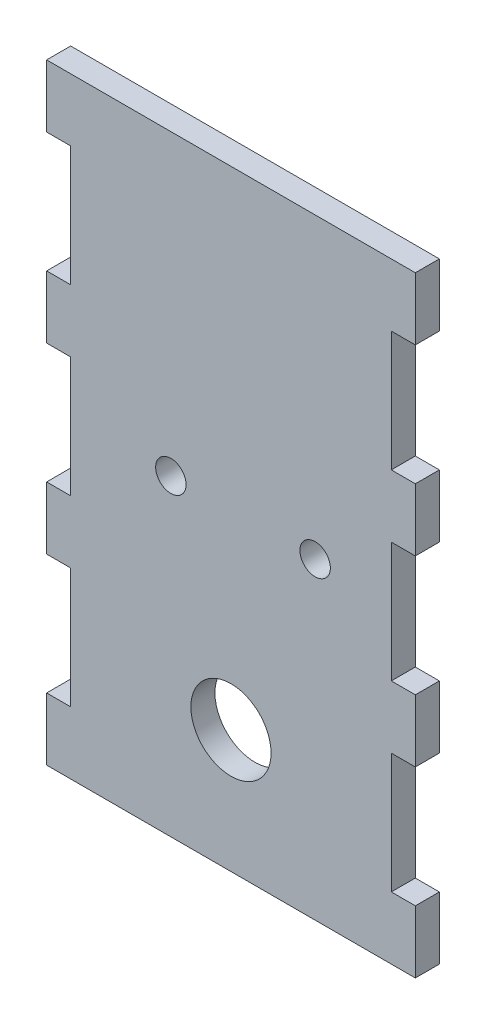
ISO-10303-21;
HEADER;
FILE_DESCRIPTION(('STEP AP214'),'2;1');
FILE_NAME('part.step','',(''),(''),'','','');
FILE_SCHEMA(('AUTOMOTIVE_DESIGN { 1 0 10303 214 1 1 1 1 }'));
ENDSEC;
DATA;
#1=APPLICATION_CONTEXT('core data for automotive mechanical design processes');
#2=APPLICATION_PROTOCOL_DEFINITION('international standard','automotive_design',2000,#1);
#3=PRODUCT_CONTEXT('',#1,'mechanical');
#4=PRODUCT('Part','Part','',(#3));
#5=PRODUCT_RELATED_PRODUCT_CATEGORY('part','',(#4));
#6=PRODUCT_DEFINITION_FORMATION('','',#4);
#7=PRODUCT_DEFINITION_CONTEXT('part definition',#1,'design');
#8=PRODUCT_DEFINITION('design','',#6,#7);
#9=PRODUCT_DEFINITION_SHAPE('','',#8);
#10=(LENGTH_UNIT() NAMED_UNIT(*) SI_UNIT(.MILLI.,.METRE.));
#11=(NAMED_UNIT(*) PLANE_ANGLE_UNIT() SI_UNIT($,.RADIAN.));
#12=(NAMED_UNIT(*) SI_UNIT($,.STERADIAN.) SOLID_ANGLE_UNIT());
#13=UNCERTAINTY_MEASURE_WITH_UNIT(LENGTH_MEASURE(1.E-05),#10,'distance_accuracy_value','');
#14=(GEOMETRIC_REPRESENTATION_CONTEXT(3) GLOBAL_UNCERTAINTY_ASSIGNED_CONTEXT((#13)) GLOBAL_UNIT_ASSIGNED_CONTEXT((#10,
#11,#12)) REPRESENTATION_CONTEXT('',''));
#15=CARTESIAN_POINT('',(0.,0.,0.));
#16=DIRECTION('',(0.,0.,1.));
#17=DIRECTION('',(1.,0.,0.));
#18=AXIS2_PLACEMENT_3D('',#15,#16,#17);
#19=CARTESIAN_POINT('',(5.00653935185185,16.5420138888889,3.));
#20=DIRECTION('',(-1.,0.,0.));
#21=DIRECTION('',(0.,-1.,0.));
#22=AXIS2_PLACEMENT_3D('',#19,#20,#21);
#23=PLANE('',#22);
#24=DIRECTION('',(0.,1.,0.));
#25=VECTOR('',#24,1.);
#26=CARTESIAN_POINT('',(5.00653935185185,16.5420138888889,0.));
#27=LINE('',#26,#25);
#28=CARTESIAN_POINT('',(5.00653935185185,-36.8579861111111,0.));
#29=VERTEX_POINT('',#28);
#30=CARTESIAN_POINT('',(5.00653935185186,-29.0579861111111,0.));
#31=VERTEX_POINT('',#30);
#32=EDGE_CURVE('E236',#29,#31,#27,.T.);
#33=ORIENTED_EDGE('',*,*,#32,.T.);
#34=DIRECTION('',(0.,0.,1.));
#35=VECTOR('',#34,1.);
#36=CARTESIAN_POINT('',(5.00653935185186,-29.0579861111111,0.));
#37=LINE('',#36,#35);
#38=CARTESIAN_POINT('',(5.00653935185186,-29.0579861111111,3.));
#39=VERTEX_POINT('',#38);
#40=EDGE_CURVE('E356',#31,#39,#37,.T.);
#41=ORIENTED_EDGE('',*,*,#40,.T.);
#42=DIRECTION('',(0.,1.,0.));
#43=VECTOR('',#42,1.);
#44=CARTESIAN_POINT('',(5.00653935185185,16.5420138888889,3.));
#45=LINE('',#44,#43);
#46=CARTESIAN_POINT('',(5.00653935185185,-36.8579861111111,3.));
#47=VERTEX_POINT('',#46);
#48=EDGE_CURVE('E238',#47,#39,#45,.T.);
#49=ORIENTED_EDGE('',*,*,#48,.F.);
#50=DIRECTION('',(0.,0.,1.));
#51=VECTOR('',#50,1.);
#52=CARTESIAN_POINT('',(5.00653935185185,-36.8579861111111,0.));
#53=LINE('',#52,#51);
#54=EDGE_CURVE('E223',#29,#47,#53,.T.);
#55=ORIENTED_EDGE('',*,*,#54,.F.);
#56=EDGE_LOOP('',(#33,#41,#49,#55));
#57=FACE_BOUND('',#56,.T.);
#58=ADVANCED_FACE('F34',(#57),#23,.F.);
#59=CARTESIAN_POINT('',(5.00653935185186,-59.6579861111111,0.));
#60=VERTEX_POINT('',#59);
#61=CARTESIAN_POINT('',(5.00653935185185,-51.8579861111111,0.));
#62=VERTEX_POINT('',#61);
#63=EDGE_CURVE('E245',#60,#62,#27,.T.);
#64=ORIENTED_EDGE('',*,*,#63,.T.);
#65=DIRECTION('',(0.,0.,1.));
#66=VECTOR('',#65,1.);
#67=CARTESIAN_POINT('',(5.00653935185185,-51.8579861111111,0.));
#68=LINE('',#67,#66);
#69=CARTESIAN_POINT('',(5.00653935185185,-51.8579861111111,3.));
#70=VERTEX_POINT('',#69);
#71=EDGE_CURVE('E384',#62,#70,#68,.T.);
#72=ORIENTED_EDGE('',*,*,#71,.T.);
#73=CARTESIAN_POINT('',(5.00653935185186,-59.6579861111111,3.));
#74=VERTEX_POINT('',#73);
#75=EDGE_CURVE('E272',#74,#70,#45,.T.);
#76=ORIENTED_EDGE('',*,*,#75,.F.);
#77=DIRECTION('',(0.,0.,-1.));
#78=VECTOR('',#77,1.);
#79=CARTESIAN_POINT('',(5.00653935185186,-59.6579861111111,3.));
#80=LINE('',#79,#78);
#81=EDGE_CURVE('E42',#74,#60,#80,.T.);
#82=ORIENTED_EDGE('',*,*,#81,.T.);
#83=EDGE_LOOP('',(#64,#72,#76,#82));
#84=FACE_BOUND('',#83,.T.);
#85=ADVANCED_FACE('F526',(#84),#23,.F.);
#86=CARTESIAN_POINT('',(-40.9934606481482,16.5420138888889,3.));
#87=DIRECTION('',(1.,0.,0.));
#88=DIRECTION('',(0.,0.,-1.));
#89=AXIS2_PLACEMENT_3D('',#86,#87,#88);
#90=PLANE('',#89);
#91=DIRECTION('',(0.,-1.,0.));
#92=VECTOR('',#91,1.);
#93=CARTESIAN_POINT('',(-40.9934606481482,16.5420138888889,0.));
#94=LINE('',#93,#92);
#95=CARTESIAN_POINT('',(-40.9934606481481,-29.0579861111111,0.));
#96=VERTEX_POINT('',#95);
#97=CARTESIAN_POINT('',(-40.9934606481482,-36.8579861111111,0.));
#98=VERTEX_POINT('',#97);
#99=EDGE_CURVE('E537',#96,#98,#94,.T.);
#100=ORIENTED_EDGE('',*,*,#99,.T.);
#101=DIRECTION('',(0.,0.,1.));
#102=VECTOR('',#101,1.);
#103=CARTESIAN_POINT('',(-40.9934606481482,-36.8579861111111,0.));
#104=LINE('',#103,#102);
#105=CARTESIAN_POINT('',(-40.9934606481482,-36.8579861111111,3.));
#106=VERTEX_POINT('',#105);
#107=EDGE_CURVE('E371',#98,#106,#104,.T.);
#108=ORIENTED_EDGE('',*,*,#107,.T.);
#109=DIRECTION('',(0.,-1.,0.));
#110=VECTOR('',#109,1.);
#111=CARTESIAN_POINT('',(-40.9934606481482,16.5420138888889,3.));
#112=LINE('',#111,#110);
#113=CARTESIAN_POINT('',(-40.9934606481481,-29.0579861111111,3.));
#114=VERTEX_POINT('',#113);
#115=EDGE_CURVE('E515',#114,#106,#112,.T.);
#116=ORIENTED_EDGE('',*,*,#115,.F.);
#117=DIRECTION('',(0.,0.,1.));
#118=VECTOR('',#117,1.);
#119=CARTESIAN_POINT('',(-40.9934606481481,-29.0579861111111,0.));
#120=LINE('',#119,#118);
#121=EDGE_CURVE('E338',#96,#114,#120,.T.);
#122=ORIENTED_EDGE('',*,*,#121,.F.);
#123=EDGE_LOOP('',(#100,#108,#116,#122));
#124=FACE_BOUND('',#123,.T.);
#125=ADVANCED_FACE('F551',(#124),#90,.F.);
#126=CARTESIAN_POINT('',(-40.9934606481481,-6.25798611111111,0.));
#127=VERTEX_POINT('',#126);
#128=CARTESIAN_POINT('',(-40.9934606481482,-14.0579861111111,0.));
#129=VERTEX_POINT('',#128);
#130=EDGE_CURVE('E265',#127,#129,#94,.T.);
#131=ORIENTED_EDGE('',*,*,#130,.T.);
#132=DIRECTION('',(0.,0.,1.));
#133=VECTOR('',#132,1.);
#134=CARTESIAN_POINT('',(-40.9934606481482,-14.0579861111111,0.));
#135=LINE('',#134,#133);
#136=CARTESIAN_POINT('',(-40.9934606481482,-14.0579861111111,3.));
#137=VERTEX_POINT('',#136);
#138=EDGE_CURVE('E305',#129,#137,#135,.T.);
#139=ORIENTED_EDGE('',*,*,#138,.T.);
#140=CARTESIAN_POINT('',(-40.9934606481481,-6.25798611111111,3.));
#141=VERTEX_POINT('',#140);
#142=EDGE_CURVE('E282',#141,#137,#112,.T.);
#143=ORIENTED_EDGE('',*,*,#142,.F.);
#144=DIRECTION('',(0.,0.,1.));
#145=VECTOR('',#144,1.);
#146=CARTESIAN_POINT('',(-40.9934606481481,-6.25798611111111,0.));
#147=LINE('',#146,#145);
#148=EDGE_CURVE('E313',#127,#141,#147,.T.);
#149=ORIENTED_EDGE('',*,*,#148,.F.);
#150=EDGE_LOOP('',(#131,#139,#143,#149));
#151=FACE_BOUND('',#150,.T.);
#152=ADVANCED_FACE('F513',(#151),#90,.F.);
#153=CARTESIAN_POINT('',(-40.9934606481482,16.5420138888889,0.));
#154=VERTEX_POINT('',#153);
#155=CARTESIAN_POINT('',(-40.9934606481482,8.74201388888889,0.));
#156=VERTEX_POINT('',#155);
#157=EDGE_CURVE('E259',#154,#156,#94,.T.);
#158=ORIENTED_EDGE('',*,*,#157,.T.);
#159=DIRECTION('',(0.,0.,1.));
#160=VECTOR('',#159,1.);
#161=CARTESIAN_POINT('',(-40.9934606481482,8.74201388888889,0.));
#162=LINE('',#161,#160);
#163=CARTESIAN_POINT('',(-40.9934606481482,8.74201388888889,3.));
#164=VERTEX_POINT('',#163);
#165=EDGE_CURVE('E320',#156,#164,#162,.T.);
#166=ORIENTED_EDGE('',*,*,#165,.T.);
#167=CARTESIAN_POINT('',(-40.9934606481482,16.5420138888889,3.));
#168=VERTEX_POINT('',#167);
#169=EDGE_CURVE('E279',#168,#164,#112,.T.);
#170=ORIENTED_EDGE('',*,*,#169,.F.);
#171=DIRECTION('',(0.,0.,-1.));
#172=VECTOR('',#171,1.);
#173=CARTESIAN_POINT('',(-40.9934606481482,16.5420138888889,3.));
#174=LINE('',#173,#172);
#175=EDGE_CURVE('E271',#168,#154,#174,.T.);
#176=ORIENTED_EDGE('',*,*,#175,.T.);
#177=EDGE_LOOP('',(#158,#166,#170,#176));
#178=FACE_BOUND('',#177,.T.);
#179=ADVANCED_FACE('F495',(#178),#90,.F.);
#180=CARTESIAN_POINT('',(5.00653935185186,-14.0579861111111,3.));
#181=VERTEX_POINT('',#180);
#182=CARTESIAN_POINT('',(5.00653935185186,-6.25798611111111,3.));
#183=VERTEX_POINT('',#182);
#184=EDGE_CURVE('E275',#181,#183,#45,.T.);
#185=ORIENTED_EDGE('',*,*,#184,.F.);
#186=DIRECTION('',(0.,0.,1.));
#187=VECTOR('',#186,1.);
#188=CARTESIAN_POINT('',(5.00653935185186,-14.0579861111111,0.));
#189=LINE('',#188,#187);
#190=CARTESIAN_POINT('',(5.00653935185186,-14.0579861111111,0.));
#191=VERTEX_POINT('',#190);
#192=EDGE_CURVE('E390',#191,#181,#189,.T.);
#193=ORIENTED_EDGE('',*,*,#192,.F.);
#194=CARTESIAN_POINT('',(5.00653935185186,-6.25798611111111,0.));
#195=VERTEX_POINT('',#194);
#196=EDGE_CURVE('E246',#191,#195,#27,.T.);
#197=ORIENTED_EDGE('',*,*,#196,.T.);
#198=DIRECTION('',(0.,0.,1.));
#199=VECTOR('',#198,1.);
#200=CARTESIAN_POINT('',(5.00653935185186,-6.25798611111111,0.));
#201=LINE('',#200,#199);
#202=EDGE_CURVE('E291',#195,#183,#201,.T.);
#203=ORIENTED_EDGE('',*,*,#202,.T.);
#204=EDGE_LOOP('',(#185,#193,#197,#203));
#205=FACE_BOUND('',#204,.T.);
#206=ADVANCED_FACE('F477',(#205),#23,.F.);
#207=CARTESIAN_POINT('',(-40.9934606481482,-51.8579861111111,3.));
#208=VERTEX_POINT('',#207);
#209=CARTESIAN_POINT('',(-40.9934606481482,-59.6579861111111,3.));
#210=VERTEX_POINT('',#209);
#211=EDGE_CURVE('E283',#208,#210,#112,.T.);
#212=ORIENTED_EDGE('',*,*,#211,.F.);
#213=DIRECTION('',(0.,0.,1.));
#214=VECTOR('',#213,1.);
#215=CARTESIAN_POINT('',(-40.9934606481482,-51.8579861111111,0.));
#216=LINE('',#215,#214);
#217=CARTESIAN_POINT('',(-40.9934606481482,-51.8579861111111,0.));
#218=VERTEX_POINT('',#217);
#219=EDGE_CURVE('E364',#218,#208,#216,.T.);
#220=ORIENTED_EDGE('',*,*,#219,.F.);
#221=CARTESIAN_POINT('',(-40.9934606481482,-59.6579861111111,0.));
#222=VERTEX_POINT('',#221);
#223=EDGE_CURVE('E267',#218,#222,#94,.T.);
#224=ORIENTED_EDGE('',*,*,#223,.T.);
#225=DIRECTION('',(0.,0.,-1.));
#226=VECTOR('',#225,1.);
#227=CARTESIAN_POINT('',(-40.9934606481482,-59.6579861111111,3.));
#228=LINE('',#227,#226);
#229=EDGE_CURVE('E11',#210,#222,#228,.T.);
#230=ORIENTED_EDGE('',*,*,#229,.F.);
#231=EDGE_LOOP('',(#212,#220,#224,#230));
#232=FACE_BOUND('',#231,.T.);
#233=ADVANCED_FACE('F36',(#232),#90,.F.);
#234=CARTESIAN_POINT('',(-40.9934606481482,-59.6579861111111,3.));
#235=DIRECTION('',(0.,1.,0.));
#236=DIRECTION('',(0.,0.,1.));
#237=AXIS2_PLACEMENT_3D('',#234,#235,#236);
#238=PLANE('',#237);
#239=DIRECTION('',(1.,0.,0.));
#240=VECTOR('',#239,1.);
#241=CARTESIAN_POINT('',(-40.9934606481482,-59.6579861111111,0.));
#242=LINE('',#241,#240);
#243=EDGE_CURVE('E253',#222,#60,#242,.T.);
#244=ORIENTED_EDGE('',*,*,#243,.T.);
#245=ORIENTED_EDGE('',*,*,#81,.F.);
#246=DIRECTION('',(1.,0.,0.));
#247=VECTOR('',#246,1.);
#248=CARTESIAN_POINT('',(-40.9934606481482,-59.6579861111111,3.));
#249=LINE('',#248,#247);
#250=EDGE_CURVE('E277',#210,#74,#249,.T.);
#251=ORIENTED_EDGE('',*,*,#250,.F.);
#252=ORIENTED_EDGE('',*,*,#229,.T.);
#253=EDGE_LOOP('',(#244,#245,#251,#252));
#254=FACE_BOUND('',#253,.T.);
#255=ADVANCED_FACE('F534',(#254),#238,.F.);
#256=CARTESIAN_POINT('',(5.00653935185186,8.74201388888887,3.));
#257=VERTEX_POINT('',#256);
#258=CARTESIAN_POINT('',(5.00653935185185,16.5420138888889,3.));
#259=VERTEX_POINT('',#258);
#260=EDGE_CURVE('E276',#257,#259,#45,.T.);
#261=ORIENTED_EDGE('',*,*,#260,.F.);
#262=DIRECTION('',(0.,0.,1.));
#263=VECTOR('',#262,1.);
#264=CARTESIAN_POINT('',(5.00653935185186,8.74201388888887,0.));
#265=LINE('',#264,#263);
#266=CARTESIAN_POINT('',(5.00653935185186,8.74201388888887,0.));
#267=VERTEX_POINT('',#266);
#268=EDGE_CURVE('E284',#267,#257,#265,.T.);
#269=ORIENTED_EDGE('',*,*,#268,.F.);
#270=CARTESIAN_POINT('',(5.00653935185185,16.5420138888889,0.));
#271=VERTEX_POINT('',#270);
#272=EDGE_CURVE('E248',#267,#271,#27,.T.);
#273=ORIENTED_EDGE('',*,*,#272,.T.);
#274=DIRECTION('',(0.,0.,-1.));
#275=VECTOR('',#274,1.);
#276=CARTESIAN_POINT('',(5.00653935185185,16.5420138888889,3.));
#277=LINE('',#276,#275);
#278=EDGE_CURVE('E485',#259,#271,#277,.T.);
#279=ORIENTED_EDGE('',*,*,#278,.F.);
#280=EDGE_LOOP('',(#261,#269,#273,#279));
#281=FACE_BOUND('',#280,.T.);
#282=ADVANCED_FACE('F486',(#281),#23,.F.);
#283=CARTESIAN_POINT('',(-40.9934606481482,16.5420138888889,3.));
#284=DIRECTION('',(0.,-1.,0.));
#285=DIRECTION('',(0.,0.,-1.));
#286=AXIS2_PLACEMENT_3D('',#283,#284,#285);
#287=PLANE('',#286);
#288=DIRECTION('',(-1.,0.,0.));
#289=VECTOR('',#288,1.);
#290=CARTESIAN_POINT('',(-40.9934606481482,16.5420138888889,0.));
#291=LINE('',#290,#289);
#292=EDGE_CURVE('E250',#271,#154,#291,.T.);
#293=ORIENTED_EDGE('',*,*,#292,.T.);
#294=ORIENTED_EDGE('',*,*,#175,.F.);
#295=DIRECTION('',(-1.,0.,0.));
#296=VECTOR('',#295,1.);
#297=CARTESIAN_POINT('',(-40.9934606481482,16.5420138888889,3.));
#298=LINE('',#297,#296);
#299=EDGE_CURVE('E269',#259,#168,#298,.T.);
#300=ORIENTED_EDGE('',*,*,#299,.F.);
#301=ORIENTED_EDGE('',*,*,#278,.T.);
#302=EDGE_LOOP('',(#293,#294,#300,#301));
#303=FACE_BOUND('',#302,.T.);
#304=ADVANCED_FACE('F463',(#303),#287,.F.);
#305=CARTESIAN_POINT('',(0.,0.,3.));
#306=DIRECTION('',(0.,0.,1.));
#307=DIRECTION('',(1.,0.,0.));
#308=AXIS2_PLACEMENT_3D('',#305,#306,#307);
#309=PLANE('',#308);
#310=CARTESIAN_POINT('',(-17.9934606481481,-44.3579861111111,3.));
#311=DIRECTION('',(0.,0.,1.));
#312=DIRECTION('',(1.,0.,0.));
#313=AXIS2_PLACEMENT_3D('',#310,#311,#312);
#314=CIRCLE('',#313,5.);
#315=CARTESIAN_POINT('',(-12.9934606481481,-44.3579861111111,3.));
#316=VERTEX_POINT('',#315);
#317=EDGE_CURVE('E436',#316,#316,#314,.F.);
#318=ORIENTED_EDGE('',*,*,#317,.T.);
#319=EDGE_LOOP('',(#318));
#320=FACE_BOUND('',#319,.T.);
#321=CARTESIAN_POINT('',(-25.4934606481488,-20.6579861111099,3.));
#322=DIRECTION('',(0.,0.,1.));
#323=DIRECTION('',(1.,0.,0.));
#324=AXIS2_PLACEMENT_3D('',#321,#322,#323);
#325=CIRCLE('',#324,1.89864999999999);
#326=CARTESIAN_POINT('',(-23.5948106481488,-20.6579861111099,3.));
#327=VERTEX_POINT('',#326);
#328=EDGE_CURVE('E432',#327,#327,#325,.T.);
#329=ORIENTED_EDGE('',*,*,#328,.F.);
#330=EDGE_LOOP('',(#329));
#331=FACE_BOUND('',#330,.T.);
#332=CARTESIAN_POINT('',(-7.49346064814882,-20.6579861111099,3.));
#333=DIRECTION('',(0.,0.,1.));
#334=DIRECTION('',(1.,0.,0.));
#335=AXIS2_PLACEMENT_3D('',#332,#333,#334);
#336=CIRCLE('',#335,1.89864999999999);
#337=CARTESIAN_POINT('',(-5.59481064814884,-20.6579861111099,3.));
#338=VERTEX_POINT('',#337);
#339=EDGE_CURVE('E426',#338,#338,#336,.T.);
#340=ORIENTED_EDGE('',*,*,#339,.F.);
#341=EDGE_LOOP('',(#340));
#342=FACE_BOUND('',#341,.T.);
#343=DIRECTION('',(1.,0.,0.));
#344=VECTOR('',#343,1.);
#345=CARTESIAN_POINT('',(5.00653935185186,-29.0579861111111,3.));
#346=LINE('',#345,#344);
#347=CARTESIAN_POINT('',(2.00653935185186,-29.0579861111111,3.));
#348=VERTEX_POINT('',#347);
#349=EDGE_CURVE('E397',#348,#39,#346,.T.);
#350=ORIENTED_EDGE('',*,*,#349,.F.);
#351=DIRECTION('',(0.,-1.,0.));
#352=VECTOR('',#351,1.);
#353=CARTESIAN_POINT('',(2.00653935185186,-14.0579861111111,3.));
#354=LINE('',#353,#352);
#355=CARTESIAN_POINT('',(2.00653935185186,-14.0579861111111,3.));
#356=VERTEX_POINT('',#355);
#357=EDGE_CURVE('E400',#356,#348,#354,.T.);
#358=ORIENTED_EDGE('',*,*,#357,.F.);
#359=DIRECTION('',(-1.,0.,0.));
#360=VECTOR('',#359,1.);
#361=CARTESIAN_POINT('',(5.00653935185186,-14.0579861111111,3.));
#362=LINE('',#361,#360);
#363=EDGE_CURVE('E374',#181,#356,#362,.T.);
#364=ORIENTED_EDGE('',*,*,#363,.F.);
#365=ORIENTED_EDGE('',*,*,#184,.T.);
#366=DIRECTION('',(1.,0.,0.));
#367=VECTOR('',#366,1.);
#368=CARTESIAN_POINT('',(5.00653935185186,-6.25798611111111,3.));
#369=LINE('',#368,#367);
#370=CARTESIAN_POINT('',(2.00653935185186,-6.25798611111111,3.));
#371=VERTEX_POINT('',#370);
#372=EDGE_CURVE('E295',#371,#183,#369,.T.);
#373=ORIENTED_EDGE('',*,*,#372,.F.);
#374=DIRECTION('',(0.,-1.,0.));
#375=VECTOR('',#374,1.);
#376=CARTESIAN_POINT('',(2.00653935185186,8.74201388888887,3.));
#377=LINE('',#376,#375);
#378=CARTESIAN_POINT('',(2.00653935185186,8.74201388888887,3.));
#379=VERTEX_POINT('',#378);
#380=EDGE_CURVE('E299',#379,#371,#377,.T.);
#381=ORIENTED_EDGE('',*,*,#380,.F.);
#382=DIRECTION('',(-1.,0.,0.));
#383=VECTOR('',#382,1.);
#384=CARTESIAN_POINT('',(5.00653935185186,8.74201388888887,3.));
#385=LINE('',#384,#383);
#386=EDGE_CURVE('E302',#257,#379,#385,.T.);
#387=ORIENTED_EDGE('',*,*,#386,.F.);
#388=ORIENTED_EDGE('',*,*,#260,.T.);
#389=ORIENTED_EDGE('',*,*,#299,.T.);
#390=ORIENTED_EDGE('',*,*,#169,.T.);
#391=DIRECTION('',(-1.,0.,0.));
#392=VECTOR('',#391,1.);
#393=CARTESIAN_POINT('',(-40.9934606481482,8.74201388888889,3.));
#394=LINE('',#393,#392);
#395=CARTESIAN_POINT('',(-37.9934606481481,8.74201388888889,3.));
#396=VERTEX_POINT('',#395);
#397=EDGE_CURVE('E323',#396,#164,#394,.T.);
#398=ORIENTED_EDGE('',*,*,#397,.F.);
#399=DIRECTION('',(0.,1.,0.));
#400=VECTOR('',#399,1.);
#401=CARTESIAN_POINT('',(-37.9934606481481,8.74201388888889,3.));
#402=LINE('',#401,#400);
#403=CARTESIAN_POINT('',(-37.9934606481481,-6.25798611111111,3.));
#404=VERTEX_POINT('',#403);
#405=EDGE_CURVE('E326',#404,#396,#402,.T.);
#406=ORIENTED_EDGE('',*,*,#405,.F.);
#407=DIRECTION('',(1.,0.,0.));
#408=VECTOR('',#407,1.);
#409=CARTESIAN_POINT('',(-40.9934606481481,-6.25798611111111,3.));
#410=LINE('',#409,#408);
#411=EDGE_CURVE('E294',#141,#404,#410,.T.);
#412=ORIENTED_EDGE('',*,*,#411,.F.);
#413=ORIENTED_EDGE('',*,*,#142,.T.);
#414=DIRECTION('',(-1.,0.,0.));
#415=VECTOR('',#414,1.);
#416=CARTESIAN_POINT('',(-40.9934606481482,-14.0579861111111,3.));
#417=LINE('',#416,#415);
#418=CARTESIAN_POINT('',(-37.9934606481481,-14.0579861111111,3.));
#419=VERTEX_POINT('',#418);
#420=EDGE_CURVE('E347',#419,#137,#417,.T.);
#421=ORIENTED_EDGE('',*,*,#420,.F.);
#422=DIRECTION('',(0.,1.,0.));
#423=VECTOR('',#422,1.);
#424=CARTESIAN_POINT('',(-37.9934606481481,-14.0579861111111,3.));
#425=LINE('',#424,#423);
#426=CARTESIAN_POINT('',(-37.9934606481481,-29.0579861111111,3.));
#427=VERTEX_POINT('',#426);
#428=EDGE_CURVE('E350',#427,#419,#425,.T.);
#429=ORIENTED_EDGE('',*,*,#428,.F.);
#430=DIRECTION('',(1.,0.,0.));
#431=VECTOR('',#430,1.);
#432=CARTESIAN_POINT('',(-40.9934606481481,-29.0579861111111,3.));
#433=LINE('',#432,#431);
#434=EDGE_CURVE('E353',#114,#427,#433,.T.);
#435=ORIENTED_EDGE('',*,*,#434,.F.);
#436=ORIENTED_EDGE('',*,*,#115,.T.);
#437=DIRECTION('',(-1.,0.,0.));
#438=VECTOR('',#437,1.);
#439=CARTESIAN_POINT('',(-40.9934606481482,-36.8579861111111,3.));
#440=LINE('',#439,#438);
#441=CARTESIAN_POINT('',(-37.9934606481482,-36.8579861111111,3.));
#442=VERTEX_POINT('',#441);
#443=EDGE_CURVE('E375',#442,#106,#440,.T.);
#444=ORIENTED_EDGE('',*,*,#443,.F.);
#445=DIRECTION('',(0.,1.,0.));
#446=VECTOR('',#445,1.);
#447=CARTESIAN_POINT('',(-37.9934606481482,-36.8579861111111,3.));
#448=LINE('',#447,#446);
#449=CARTESIAN_POINT('',(-37.9934606481482,-51.8579861111111,3.));
#450=VERTEX_POINT('',#449);
#451=EDGE_CURVE('E378',#450,#442,#448,.T.);
#452=ORIENTED_EDGE('',*,*,#451,.F.);
#453=DIRECTION('',(1.,0.,0.));
#454=VECTOR('',#453,1.);
#455=CARTESIAN_POINT('',(-40.9934606481482,-51.8579861111111,3.));
#456=LINE('',#455,#454);
#457=EDGE_CURVE('E381',#208,#450,#456,.T.);
#458=ORIENTED_EDGE('',*,*,#457,.F.);
#459=ORIENTED_EDGE('',*,*,#211,.T.);
#460=ORIENTED_EDGE('',*,*,#250,.T.);
#461=ORIENTED_EDGE('',*,*,#75,.T.);
#462=DIRECTION('',(1.,0.,0.));
#463=VECTOR('',#462,1.);
#464=CARTESIAN_POINT('',(5.00653935185185,-51.8579861111111,3.));
#465=LINE('',#464,#463);
#466=CARTESIAN_POINT('',(2.00653935185185,-51.8579861111111,3.));
#467=VERTEX_POINT('',#466);
#468=EDGE_CURVE('E230',#467,#70,#465,.T.);
#469=ORIENTED_EDGE('',*,*,#468,.F.);
#470=DIRECTION('',(0.,-1.,0.));
#471=VECTOR('',#470,1.);
#472=CARTESIAN_POINT('',(2.00653935185185,-36.8579861111111,3.));
#473=LINE('',#472,#471);
#474=CARTESIAN_POINT('',(2.00653935185185,-36.8579861111111,3.));
#475=VERTEX_POINT('',#474);
#476=EDGE_CURVE('E415',#475,#467,#473,.T.);
#477=ORIENTED_EDGE('',*,*,#476,.F.);
#478=DIRECTION('',(-1.,0.,0.));
#479=VECTOR('',#478,1.);
#480=CARTESIAN_POINT('',(5.00653935185185,-36.8579861111111,3.));
#481=LINE('',#480,#479);
#482=EDGE_CURVE('E418',#47,#475,#481,.T.);
#483=ORIENTED_EDGE('',*,*,#482,.F.);
#484=ORIENTED_EDGE('',*,*,#48,.T.);
#485=EDGE_LOOP('',(#350,#358,#364,#365,#373,#381,#387,#388,#389,#390,#398,#406,#412,#413,#421,
#429,#435,#436,#444,#452,#458,#459,#460,#461,#469,#477,#483,#484));
#486=FACE_BOUND('',#485,.T.);
#487=ADVANCED_FACE('F447',(#320,#331,#342,#486),#309,.T.);
#488=CARTESIAN_POINT('',(0.,0.,0.));
#489=DIRECTION('',(0.,0.,1.));
#490=DIRECTION('',(1.,0.,0.));
#491=AXIS2_PLACEMENT_3D('',#488,#489,#490);
#492=PLANE('',#491);
#493=CARTESIAN_POINT('',(-17.9934606481481,-44.3579861111111,0.));
#494=DIRECTION('',(0.,0.,-1.));
#495=DIRECTION('',(-1.,0.,0.));
#496=AXIS2_PLACEMENT_3D('',#493,#494,#495);
#497=CIRCLE('',#496,5.);
#498=CARTESIAN_POINT('',(-22.9934606481481,-44.3579861111111,0.));
#499=VERTEX_POINT('',#498);
#500=EDGE_CURVE('E435',#499,#499,#497,.T.);
#501=ORIENTED_EDGE('',*,*,#500,.F.);
#502=EDGE_LOOP('',(#501));
#503=FACE_BOUND('',#502,.T.);
#504=CARTESIAN_POINT('',(-25.4934606481488,-20.6579861111099,0.));
#505=DIRECTION('',(0.,0.,1.));
#506=DIRECTION('',(1.,0.,0.));
#507=AXIS2_PLACEMENT_3D('',#504,#505,#506);
#508=CIRCLE('',#507,1.89864999999999);
#509=CARTESIAN_POINT('',(-23.5948106481488,-20.6579861111099,0.));
#510=VERTEX_POINT('',#509);
#511=EDGE_CURVE('E429',#510,#510,#508,.T.);
#512=ORIENTED_EDGE('',*,*,#511,.T.);
#513=EDGE_LOOP('',(#512));
#514=FACE_BOUND('',#513,.T.);
#515=CARTESIAN_POINT('',(-7.49346064814882,-20.6579861111099,0.));
#516=DIRECTION('',(0.,0.,1.));
#517=DIRECTION('',(1.,0.,0.));
#518=AXIS2_PLACEMENT_3D('',#515,#516,#517);
#519=CIRCLE('',#518,1.89864999999999);
#520=CARTESIAN_POINT('',(-5.59481064814884,-20.6579861111099,0.));
#521=VERTEX_POINT('',#520);
#522=EDGE_CURVE('E420',#521,#521,#519,.T.);
#523=ORIENTED_EDGE('',*,*,#522,.T.);
#524=EDGE_LOOP('',(#523));
#525=FACE_BOUND('',#524,.T.);
#526=DIRECTION('',(0.,-1.,0.));
#527=VECTOR('',#526,1.);
#528=CARTESIAN_POINT('',(2.00653935185186,-14.0579861111111,0.));
#529=LINE('',#528,#527);
#530=CARTESIAN_POINT('',(2.00653935185186,-14.0579861111111,0.));
#531=VERTEX_POINT('',#530);
#532=CARTESIAN_POINT('',(2.00653935185186,-29.0579861111111,0.));
#533=VERTEX_POINT('',#532);
#534=EDGE_CURVE('E49',#531,#533,#529,.T.);
#535=ORIENTED_EDGE('',*,*,#534,.T.);
#536=DIRECTION('',(1.,0.,0.));
#537=VECTOR('',#536,1.);
#538=CARTESIAN_POINT('',(5.00653935185186,-29.0579861111111,0.));
#539=LINE('',#538,#537);
#540=EDGE_CURVE('E244',#533,#31,#539,.T.);
#541=ORIENTED_EDGE('',*,*,#540,.T.);
#542=ORIENTED_EDGE('',*,*,#32,.F.);
#543=DIRECTION('',(-1.,0.,0.));
#544=VECTOR('',#543,1.);
#545=CARTESIAN_POINT('',(5.00653935185185,-36.8579861111111,0.));
#546=LINE('',#545,#544);
#547=CARTESIAN_POINT('',(2.00653935185185,-36.8579861111111,0.));
#548=VERTEX_POINT('',#547);
#549=EDGE_CURVE('E219',#29,#548,#546,.T.);
#550=ORIENTED_EDGE('',*,*,#549,.T.);
#551=DIRECTION('',(0.,-1.,0.));
#552=VECTOR('',#551,1.);
#553=CARTESIAN_POINT('',(2.00653935185185,-36.8579861111111,0.));
#554=LINE('',#553,#552);
#555=CARTESIAN_POINT('',(2.00653935185185,-51.8579861111111,0.));
#556=VERTEX_POINT('',#555);
#557=EDGE_CURVE('E229',#548,#556,#554,.T.);
#558=ORIENTED_EDGE('',*,*,#557,.T.);
#559=DIRECTION('',(1.,0.,0.));
#560=VECTOR('',#559,1.);
#561=CARTESIAN_POINT('',(5.00653935185185,-51.8579861111111,0.));
#562=LINE('',#561,#560);
#563=EDGE_CURVE('E239',#556,#62,#562,.T.);
#564=ORIENTED_EDGE('',*,*,#563,.T.);
#565=ORIENTED_EDGE('',*,*,#63,.F.);
#566=ORIENTED_EDGE('',*,*,#243,.F.);
#567=ORIENTED_EDGE('',*,*,#223,.F.);
#568=DIRECTION('',(1.,0.,0.));
#569=VECTOR('',#568,1.);
#570=CARTESIAN_POINT('',(-40.9934606481482,-51.8579861111111,0.));
#571=LINE('',#570,#569);
#572=CARTESIAN_POINT('',(-37.9934606481482,-51.8579861111111,0.));
#573=VERTEX_POINT('',#572);
#574=EDGE_CURVE('E377',#218,#573,#571,.T.);
#575=ORIENTED_EDGE('',*,*,#574,.T.);
#576=DIRECTION('',(0.,1.,0.));
#577=VECTOR('',#576,1.);
#578=CARTESIAN_POINT('',(-37.9934606481482,-36.8579861111111,0.));
#579=LINE('',#578,#577);
#580=CARTESIAN_POINT('',(-37.9934606481482,-36.8579861111111,0.));
#581=VERTEX_POINT('',#580);
#582=EDGE_CURVE('E57',#573,#581,#579,.T.);
#583=ORIENTED_EDGE('',*,*,#582,.T.);
#584=DIRECTION('',(-1.,0.,0.));
#585=VECTOR('',#584,1.);
#586=CARTESIAN_POINT('',(-40.9934606481482,-36.8579861111111,0.));
#587=LINE('',#586,#585);
#588=EDGE_CURVE('E367',#581,#98,#587,.T.);
#589=ORIENTED_EDGE('',*,*,#588,.T.);
#590=ORIENTED_EDGE('',*,*,#99,.F.);
#591=DIRECTION('',(1.,0.,0.));
#592=VECTOR('',#591,1.);
#593=CARTESIAN_POINT('',(-40.9934606481481,-29.0579861111111,0.));
#594=LINE('',#593,#592);
#595=CARTESIAN_POINT('',(-37.9934606481481,-29.0579861111111,0.));
#596=VERTEX_POINT('',#595);
#597=EDGE_CURVE('E349',#96,#596,#594,.T.);
#598=ORIENTED_EDGE('',*,*,#597,.T.);
#599=DIRECTION('',(0.,1.,0.));
#600=VECTOR('',#599,1.);
#601=CARTESIAN_POINT('',(-37.9934606481481,-14.0579861111111,0.));
#602=LINE('',#601,#600);
#603=CARTESIAN_POINT('',(-37.9934606481481,-14.0579861111111,0.));
#604=VERTEX_POINT('',#603);
#605=EDGE_CURVE('E359',#596,#604,#602,.T.);
#606=ORIENTED_EDGE('',*,*,#605,.T.);
#607=DIRECTION('',(-1.,0.,0.));
#608=VECTOR('',#607,1.);
#609=CARTESIAN_POINT('',(-40.9934606481482,-14.0579861111111,0.));
#610=LINE('',#609,#608);
#611=EDGE_CURVE('E341',#604,#129,#610,.T.);
#612=ORIENTED_EDGE('',*,*,#611,.T.);
#613=ORIENTED_EDGE('',*,*,#130,.F.);
#614=DIRECTION('',(1.,0.,0.));
#615=VECTOR('',#614,1.);
#616=CARTESIAN_POINT('',(-40.9934606481481,-6.25798611111111,0.));
#617=LINE('',#616,#615);
#618=CARTESIAN_POINT('',(-37.9934606481481,-6.25798611111111,0.));
#619=VERTEX_POINT('',#618);
#620=EDGE_CURVE('E325',#127,#619,#617,.T.);
#621=ORIENTED_EDGE('',*,*,#620,.T.);
#622=DIRECTION('',(0.,1.,0.));
#623=VECTOR('',#622,1.);
#624=CARTESIAN_POINT('',(-37.9934606481481,8.74201388888889,0.));
#625=LINE('',#624,#623);
#626=CARTESIAN_POINT('',(-37.9934606481481,8.74201388888889,0.));
#627=VERTEX_POINT('',#626);
#628=EDGE_CURVE('E333',#619,#627,#625,.T.);
#629=ORIENTED_EDGE('',*,*,#628,.T.);
#630=DIRECTION('',(-1.,0.,0.));
#631=VECTOR('',#630,1.);
#632=CARTESIAN_POINT('',(-40.9934606481482,8.74201388888889,0.));
#633=LINE('',#632,#631);
#634=EDGE_CURVE('E316',#627,#156,#633,.T.);
#635=ORIENTED_EDGE('',*,*,#634,.T.);
#636=ORIENTED_EDGE('',*,*,#157,.F.);
#637=ORIENTED_EDGE('',*,*,#292,.F.);
#638=ORIENTED_EDGE('',*,*,#272,.F.);
#639=DIRECTION('',(-1.,0.,0.));
#640=VECTOR('',#639,1.);
#641=CARTESIAN_POINT('',(5.00653935185186,8.74201388888887,0.));
#642=LINE('',#641,#640);
#643=CARTESIAN_POINT('',(2.00653935185186,8.74201388888887,0.));
#644=VERTEX_POINT('',#643);
#645=EDGE_CURVE('E298',#267,#644,#642,.T.);
#646=ORIENTED_EDGE('',*,*,#645,.T.);
#647=DIRECTION('',(0.,-1.,0.));
#648=VECTOR('',#647,1.);
#649=CARTESIAN_POINT('',(2.00653935185186,8.74201388888887,0.));
#650=LINE('',#649,#648);
#651=CARTESIAN_POINT('',(2.00653935185186,-6.25798611111111,0.));
#652=VERTEX_POINT('',#651);
#653=EDGE_CURVE('E308',#644,#652,#650,.T.);
#654=ORIENTED_EDGE('',*,*,#653,.T.);
#655=DIRECTION('',(1.,0.,0.));
#656=VECTOR('',#655,1.);
#657=CARTESIAN_POINT('',(5.00653935185186,-6.25798611111111,0.));
#658=LINE('',#657,#656);
#659=EDGE_CURVE('E287',#652,#195,#658,.T.);
#660=ORIENTED_EDGE('',*,*,#659,.T.);
#661=ORIENTED_EDGE('',*,*,#196,.F.);
#662=DIRECTION('',(-1.,0.,0.));
#663=VECTOR('',#662,1.);
#664=CARTESIAN_POINT('',(5.00653935185186,-14.0579861111111,0.));
#665=LINE('',#664,#663);
#666=EDGE_CURVE('E399',#191,#531,#665,.T.);
#667=ORIENTED_EDGE('',*,*,#666,.T.);
#668=EDGE_LOOP('',(#535,#541,#542,#550,#558,#564,#565,#566,#567,#575,#583,#589,#590,#598,#606,
#612,#613,#621,#629,#635,#636,#637,#638,#646,#654,#660,#661,#667));
#669=FACE_BOUND('',#668,.T.);
#670=ADVANCED_FACE('F242',(#503,#514,#525,#669),#492,.F.);
#671=CARTESIAN_POINT('',(5.00653935185186,-6.25798611111111,0.));
#672=DIRECTION('',(0.,-1.,0.));
#673=DIRECTION('',(0.,0.,-1.));
#674=AXIS2_PLACEMENT_3D('',#671,#672,#673);
#675=PLANE('',#674);
#676=ORIENTED_EDGE('',*,*,#372,.T.);
#677=ORIENTED_EDGE('',*,*,#202,.F.);
#678=ORIENTED_EDGE('',*,*,#659,.F.);
#679=DIRECTION('',(0.,0.,1.));
#680=VECTOR('',#679,1.);
#681=CARTESIAN_POINT('',(2.00653935185186,-6.25798611111111,0.));
#682=LINE('',#681,#680);
#683=EDGE_CURVE('E289',#652,#371,#682,.T.);
#684=ORIENTED_EDGE('',*,*,#683,.T.);
#685=EDGE_LOOP('',(#676,#677,#678,#684));
#686=FACE_BOUND('',#685,.T.);
#687=ADVANCED_FACE('F446',(#686),#675,.F.);
#688=CARTESIAN_POINT('',(2.00653935185186,8.74201388888887,0.));
#689=DIRECTION('',(-1.,0.,0.));
#690=DIRECTION('',(0.,0.,1.));
#691=AXIS2_PLACEMENT_3D('',#688,#689,#690);
#692=PLANE('',#691);
#693=ORIENTED_EDGE('',*,*,#380,.T.);
#694=ORIENTED_EDGE('',*,*,#683,.F.);
#695=ORIENTED_EDGE('',*,*,#653,.F.);
#696=DIRECTION('',(0.,0.,1.));
#697=VECTOR('',#696,1.);
#698=CARTESIAN_POINT('',(2.00653935185186,8.74201388888887,0.));
#699=LINE('',#698,#697);
#700=EDGE_CURVE('E286',#644,#379,#699,.T.);
#701=ORIENTED_EDGE('',*,*,#700,.T.);
#702=EDGE_LOOP('',(#693,#694,#695,#701));
#703=FACE_BOUND('',#702,.T.);
#704=ADVANCED_FACE('F637',(#703),#692,.F.);
#705=CARTESIAN_POINT('',(5.00653935185186,8.74201388888887,0.));
#706=DIRECTION('',(0.,1.,0.));
#707=DIRECTION('',(-1.,0.,0.));
#708=AXIS2_PLACEMENT_3D('',#705,#706,#707);
#709=PLANE('',#708);
#710=ORIENTED_EDGE('',*,*,#386,.T.);
#711=ORIENTED_EDGE('',*,*,#700,.F.);
#712=ORIENTED_EDGE('',*,*,#645,.F.);
#713=ORIENTED_EDGE('',*,*,#268,.T.);
#714=EDGE_LOOP('',(#710,#711,#712,#713));
#715=FACE_BOUND('',#714,.T.);
#716=ADVANCED_FACE('F628',(#715),#709,.F.);
#717=CARTESIAN_POINT('',(-40.9934606481482,8.74201388888889,0.));
#718=DIRECTION('',(0.,1.,0.));
#719=DIRECTION('',(0.,0.,1.));
#720=AXIS2_PLACEMENT_3D('',#717,#718,#719);
#721=PLANE('',#720);
#722=ORIENTED_EDGE('',*,*,#397,.T.);
#723=ORIENTED_EDGE('',*,*,#165,.F.);
#724=ORIENTED_EDGE('',*,*,#634,.F.);
#725=DIRECTION('',(0.,0.,1.));
#726=VECTOR('',#725,1.);
#727=CARTESIAN_POINT('',(-37.9934606481481,8.74201388888889,0.));
#728=LINE('',#727,#726);
#729=EDGE_CURVE('E318',#627,#396,#728,.T.);
#730=ORIENTED_EDGE('',*,*,#729,.T.);
#731=EDGE_LOOP('',(#722,#723,#724,#730));
#732=FACE_BOUND('',#731,.T.);
#733=ADVANCED_FACE('F500',(#732),#721,.F.);
#734=CARTESIAN_POINT('',(-37.9934606481481,8.74201388888889,0.));
#735=DIRECTION('',(1.,0.,0.));
#736=DIRECTION('',(0.,0.,-1.));
#737=AXIS2_PLACEMENT_3D('',#734,#735,#736);
#738=PLANE('',#737);
#739=ORIENTED_EDGE('',*,*,#405,.T.);
#740=ORIENTED_EDGE('',*,*,#729,.F.);
#741=ORIENTED_EDGE('',*,*,#628,.F.);
#742=DIRECTION('',(0.,0.,1.));
#743=VECTOR('',#742,1.);
#744=CARTESIAN_POINT('',(-37.9934606481481,-6.25798611111111,0.));
#745=LINE('',#744,#743);
#746=EDGE_CURVE('E315',#619,#404,#745,.T.);
#747=ORIENTED_EDGE('',*,*,#746,.T.);
#748=EDGE_LOOP('',(#739,#740,#741,#747));
#749=FACE_BOUND('',#748,.T.);
#750=ADVANCED_FACE('F503',(#749),#738,.F.);
#751=CARTESIAN_POINT('',(-40.9934606481481,-6.25798611111111,0.));
#752=DIRECTION('',(0.,-1.,0.));
#753=DIRECTION('',(1.,0.,0.));
#754=AXIS2_PLACEMENT_3D('',#751,#752,#753);
#755=PLANE('',#754);
#756=ORIENTED_EDGE('',*,*,#411,.T.);
#757=ORIENTED_EDGE('',*,*,#746,.F.);
#758=ORIENTED_EDGE('',*,*,#620,.F.);
#759=ORIENTED_EDGE('',*,*,#148,.T.);
#760=EDGE_LOOP('',(#756,#757,#758,#759));
#761=FACE_BOUND('',#760,.T.);
#762=ADVANCED_FACE('F506',(#761),#755,.F.);
#763=CARTESIAN_POINT('',(-40.9934606481482,-14.0579861111111,0.));
#764=DIRECTION('',(0.,1.,0.));
#765=DIRECTION('',(0.,0.,1.));
#766=AXIS2_PLACEMENT_3D('',#763,#764,#765);
#767=PLANE('',#766);
#768=ORIENTED_EDGE('',*,*,#420,.T.);
#769=ORIENTED_EDGE('',*,*,#138,.F.);
#770=ORIENTED_EDGE('',*,*,#611,.F.);
#771=DIRECTION('',(0.,0.,1.));
#772=VECTOR('',#771,1.);
#773=CARTESIAN_POINT('',(-37.9934606481481,-14.0579861111111,0.));
#774=LINE('',#773,#772);
#775=EDGE_CURVE('E343',#604,#419,#774,.T.);
#776=ORIENTED_EDGE('',*,*,#775,.T.);
#777=EDGE_LOOP('',(#768,#769,#770,#776));
#778=FACE_BOUND('',#777,.T.);
#779=ADVANCED_FACE('F544',(#778),#767,.F.);
#780=CARTESIAN_POINT('',(-37.9934606481481,-14.0579861111111,0.));
#781=DIRECTION('',(1.,0.,0.));
#782=DIRECTION('',(0.,0.,-1.));
#783=AXIS2_PLACEMENT_3D('',#780,#781,#782);
#784=PLANE('',#783);
#785=ORIENTED_EDGE('',*,*,#428,.T.);
#786=ORIENTED_EDGE('',*,*,#775,.F.);
#787=ORIENTED_EDGE('',*,*,#605,.F.);
#788=DIRECTION('',(0.,0.,1.));
#789=VECTOR('',#788,1.);
#790=CARTESIAN_POINT('',(-37.9934606481481,-29.0579861111111,0.));
#791=LINE('',#790,#789);
#792=EDGE_CURVE('E340',#596,#427,#791,.T.);
#793=ORIENTED_EDGE('',*,*,#792,.T.);
#794=EDGE_LOOP('',(#785,#786,#787,#793));
#795=FACE_BOUND('',#794,.T.);
#796=ADVANCED_FACE('F547',(#795),#784,.F.);
#797=CARTESIAN_POINT('',(-40.9934606481481,-29.0579861111111,0.));
#798=DIRECTION('',(0.,-1.,0.));
#799=DIRECTION('',(1.,0.,0.));
#800=AXIS2_PLACEMENT_3D('',#797,#798,#799);
#801=PLANE('',#800);
#802=ORIENTED_EDGE('',*,*,#434,.T.);
#803=ORIENTED_EDGE('',*,*,#792,.F.);
#804=ORIENTED_EDGE('',*,*,#597,.F.);
#805=ORIENTED_EDGE('',*,*,#121,.T.);
#806=EDGE_LOOP('',(#802,#803,#804,#805));
#807=FACE_BOUND('',#806,.T.);
#808=ADVANCED_FACE('F550',(#807),#801,.F.);
#809=CARTESIAN_POINT('',(5.00653935185185,-51.8579861111111,0.));
#810=DIRECTION('',(0.,-1.,0.));
#811=DIRECTION('',(0.,0.,-1.));
#812=AXIS2_PLACEMENT_3D('',#809,#810,#811);
#813=PLANE('',#812);
#814=ORIENTED_EDGE('',*,*,#468,.T.);
#815=ORIENTED_EDGE('',*,*,#71,.F.);
#816=ORIENTED_EDGE('',*,*,#563,.F.);
#817=DIRECTION('',(0.,0.,1.));
#818=VECTOR('',#817,1.);
#819=CARTESIAN_POINT('',(2.00653935185185,-51.8579861111111,0.));
#820=LINE('',#819,#818);
#821=EDGE_CURVE('E410',#556,#467,#820,.T.);
#822=ORIENTED_EDGE('',*,*,#821,.T.);
#823=EDGE_LOOP('',(#814,#815,#816,#822));
#824=FACE_BOUND('',#823,.T.);
#825=ADVANCED_FACE('F530',(#824),#813,.F.);
#826=CARTESIAN_POINT('',(2.00653935185185,-36.8579861111111,0.));
#827=DIRECTION('',(-1.,0.,0.));
#828=DIRECTION('',(0.,0.,1.));
#829=AXIS2_PLACEMENT_3D('',#826,#827,#828);
#830=PLANE('',#829);
#831=ORIENTED_EDGE('',*,*,#476,.T.);
#832=ORIENTED_EDGE('',*,*,#821,.F.);
#833=ORIENTED_EDGE('',*,*,#557,.F.);
#834=DIRECTION('',(0.,0.,1.));
#835=VECTOR('',#834,1.);
#836=CARTESIAN_POINT('',(2.00653935185185,-36.8579861111111,0.));
#837=LINE('',#836,#835);
#838=EDGE_CURVE('E225',#548,#475,#837,.T.);
#839=ORIENTED_EDGE('',*,*,#838,.T.);
#840=EDGE_LOOP('',(#831,#832,#833,#839));
#841=FACE_BOUND('',#840,.T.);
#842=ADVANCED_FACE('F715',(#841),#830,.F.);
#843=CARTESIAN_POINT('',(5.00653935185185,-36.8579861111111,0.));
#844=DIRECTION('',(0.,1.,0.));
#845=DIRECTION('',(-1.,0.,0.));
#846=AXIS2_PLACEMENT_3D('',#843,#844,#845);
#847=PLANE('',#846);
#848=ORIENTED_EDGE('',*,*,#482,.T.);
#849=ORIENTED_EDGE('',*,*,#838,.F.);
#850=ORIENTED_EDGE('',*,*,#549,.F.);
#851=ORIENTED_EDGE('',*,*,#54,.T.);
#852=EDGE_LOOP('',(#848,#849,#850,#851));
#853=FACE_BOUND('',#852,.T.);
#854=ADVANCED_FACE('F222',(#853),#847,.F.);
#855=CARTESIAN_POINT('',(-40.9934606481482,-36.8579861111111,0.));
#856=DIRECTION('',(0.,1.,0.));
#857=DIRECTION('',(0.,0.,1.));
#858=AXIS2_PLACEMENT_3D('',#855,#856,#857);
#859=PLANE('',#858);
#860=ORIENTED_EDGE('',*,*,#443,.T.);
#861=ORIENTED_EDGE('',*,*,#107,.F.);
#862=ORIENTED_EDGE('',*,*,#588,.F.);
#863=DIRECTION('',(0.,0.,1.));
#864=VECTOR('',#863,1.);
#865=CARTESIAN_POINT('',(-37.9934606481482,-36.8579861111111,0.));
#866=LINE('',#865,#864);
#867=EDGE_CURVE('E369',#581,#442,#866,.T.);
#868=ORIENTED_EDGE('',*,*,#867,.T.);
#869=EDGE_LOOP('',(#860,#861,#862,#868));
#870=FACE_BOUND('',#869,.T.);
#871=ADVANCED_FACE('F554',(#870),#859,.F.);
#872=CARTESIAN_POINT('',(-37.9934606481482,-36.8579861111111,0.));
#873=DIRECTION('',(1.,0.,0.));
#874=DIRECTION('',(0.,0.,-1.));
#875=AXIS2_PLACEMENT_3D('',#872,#873,#874);
#876=PLANE('',#875);
#877=ORIENTED_EDGE('',*,*,#451,.T.);
#878=ORIENTED_EDGE('',*,*,#867,.F.);
#879=ORIENTED_EDGE('',*,*,#582,.F.);
#880=DIRECTION('',(0.,0.,1.));
#881=VECTOR('',#880,1.);
#882=CARTESIAN_POINT('',(-37.9934606481482,-51.8579861111111,0.));
#883=LINE('',#882,#881);
#884=EDGE_CURVE('E366',#573,#450,#883,.T.);
#885=ORIENTED_EDGE('',*,*,#884,.T.);
#886=EDGE_LOOP('',(#877,#878,#879,#885));
#887=FACE_BOUND('',#886,.T.);
#888=ADVANCED_FACE('F556',(#887),#876,.F.);
#889=CARTESIAN_POINT('',(-40.9934606481482,-51.8579861111111,0.));
#890=DIRECTION('',(0.,-1.,0.));
#891=DIRECTION('',(1.,0.,0.));
#892=AXIS2_PLACEMENT_3D('',#889,#890,#891);
#893=PLANE('',#892);
#894=ORIENTED_EDGE('',*,*,#457,.T.);
#895=ORIENTED_EDGE('',*,*,#884,.F.);
#896=ORIENTED_EDGE('',*,*,#574,.F.);
#897=ORIENTED_EDGE('',*,*,#219,.T.);
#898=EDGE_LOOP('',(#894,#895,#896,#897));
#899=FACE_BOUND('',#898,.T.);
#900=ADVANCED_FACE('F558',(#899),#893,.F.);
#901=CARTESIAN_POINT('',(5.00653935185186,-29.0579861111111,0.));
#902=DIRECTION('',(0.,-1.,0.));
#903=DIRECTION('',(0.,0.,-1.));
#904=AXIS2_PLACEMENT_3D('',#901,#902,#903);
#905=PLANE('',#904);
#906=ORIENTED_EDGE('',*,*,#349,.T.);
#907=ORIENTED_EDGE('',*,*,#40,.F.);
#908=ORIENTED_EDGE('',*,*,#540,.F.);
#909=DIRECTION('',(0.,0.,1.));
#910=VECTOR('',#909,1.);
#911=CARTESIAN_POINT('',(2.00653935185186,-29.0579861111111,0.));
#912=LINE('',#911,#910);
#913=EDGE_CURVE('E394',#533,#348,#912,.T.);
#914=ORIENTED_EDGE('',*,*,#913,.T.);
#915=EDGE_LOOP('',(#906,#907,#908,#914));
#916=FACE_BOUND('',#915,.T.);
#917=ADVANCED_FACE('F470',(#916),#905,.F.);
#918=CARTESIAN_POINT('',(2.00653935185186,-14.0579861111111,0.));
#919=DIRECTION('',(-1.,0.,0.));
#920=DIRECTION('',(0.,0.,1.));
#921=AXIS2_PLACEMENT_3D('',#918,#919,#920);
#922=PLANE('',#921);
#923=ORIENTED_EDGE('',*,*,#357,.T.);
#924=ORIENTED_EDGE('',*,*,#913,.F.);
#925=ORIENTED_EDGE('',*,*,#534,.F.);
#926=DIRECTION('',(0.,0.,1.));
#927=VECTOR('',#926,1.);
#928=CARTESIAN_POINT('',(2.00653935185186,-14.0579861111111,0.));
#929=LINE('',#928,#927);
#930=EDGE_CURVE('E392',#531,#356,#929,.T.);
#931=ORIENTED_EDGE('',*,*,#930,.T.);
#932=EDGE_LOOP('',(#923,#924,#925,#931));
#933=FACE_BOUND('',#932,.T.);
#934=ADVANCED_FACE('F471',(#933),#922,.F.);
#935=CARTESIAN_POINT('',(5.00653935185186,-14.0579861111111,0.));
#936=DIRECTION('',(0.,1.,0.));
#937=DIRECTION('',(-1.,0.,0.));
#938=AXIS2_PLACEMENT_3D('',#935,#936,#937);
#939=PLANE('',#938);
#940=ORIENTED_EDGE('',*,*,#363,.T.);
#941=ORIENTED_EDGE('',*,*,#930,.F.);
#942=ORIENTED_EDGE('',*,*,#666,.F.);
#943=ORIENTED_EDGE('',*,*,#192,.T.);
#944=EDGE_LOOP('',(#940,#941,#942,#943));
#945=FACE_BOUND('',#944,.T.);
#946=ADVANCED_FACE('F457',(#945),#939,.F.);
#947=CARTESIAN_POINT('',(-7.49346064814882,-20.6579861111099,3.));
#948=DIRECTION('',(0.,0.,1.));
#949=DIRECTION('',(1.,0.,0.));
#950=AXIS2_PLACEMENT_3D('',#947,#948,#949);
#951=CYLINDRICAL_SURFACE('',#950,1.89864999999999);
#952=ORIENTED_EDGE('',*,*,#522,.F.);
#953=EDGE_LOOP('',(#952));
#954=FACE_BOUND('',#953,.T.);
#955=ORIENTED_EDGE('',*,*,#339,.T.);
#956=EDGE_LOOP('',(#955));
#957=FACE_BOUND('',#956,.T.);
#958=ADVANCED_FACE('F453',(#954,#957),#951,.F.);
#959=CARTESIAN_POINT('',(-25.4934606481488,-20.6579861111099,3.));
#960=DIRECTION('',(0.,0.,1.));
#961=DIRECTION('',(1.,0.,0.));
#962=AXIS2_PLACEMENT_3D('',#959,#960,#961);
#963=CYLINDRICAL_SURFACE('',#962,1.89864999999999);
#964=ORIENTED_EDGE('',*,*,#511,.F.);
#965=EDGE_LOOP('',(#964));
#966=FACE_BOUND('',#965,.T.);
#967=ORIENTED_EDGE('',*,*,#328,.T.);
#968=EDGE_LOOP('',(#967));
#969=FACE_BOUND('',#968,.T.);
#970=ADVANCED_FACE('F456',(#966,#969),#963,.F.);
#971=CARTESIAN_POINT('',(-17.9934606481481,-44.3579861111111,3.001));
#972=DIRECTION('',(0.,0.,-1.));
#973=DIRECTION('',(-1.,0.,0.));
#974=AXIS2_PLACEMENT_3D('',#971,#972,#973);
#975=CYLINDRICAL_SURFACE('',#974,5.);
#976=ORIENTED_EDGE('',*,*,#317,.F.);
#977=EDGE_LOOP('',(#976));
#978=FACE_BOUND('',#977,.T.);
#979=ORIENTED_EDGE('',*,*,#500,.T.);
#980=EDGE_LOOP('',(#979));
#981=FACE_BOUND('',#980,.T.);
#982=ADVANCED_FACE('F442',(#978,#981),#975,.F.);
#983=CLOSED_SHELL('',(#58,#85,#125,#152,#179,#206,#233,#255,#282,#304,#487,#670,#687,#704,#716,
#733,#750,#762,#779,#796,#808,#825,#842,#854,#871,#888,#900,#917,#934,#946,#958,#970,#982));
#984=MANIFOLD_SOLID_BREP('B2',#983);
#985=ADVANCED_BREP_SHAPE_REPRESENTATION('',(#18,#984),#14);
#986=SHAPE_DEFINITION_REPRESENTATION(#9,#985);
ENDSEC;
END-ISO-10303-21;
